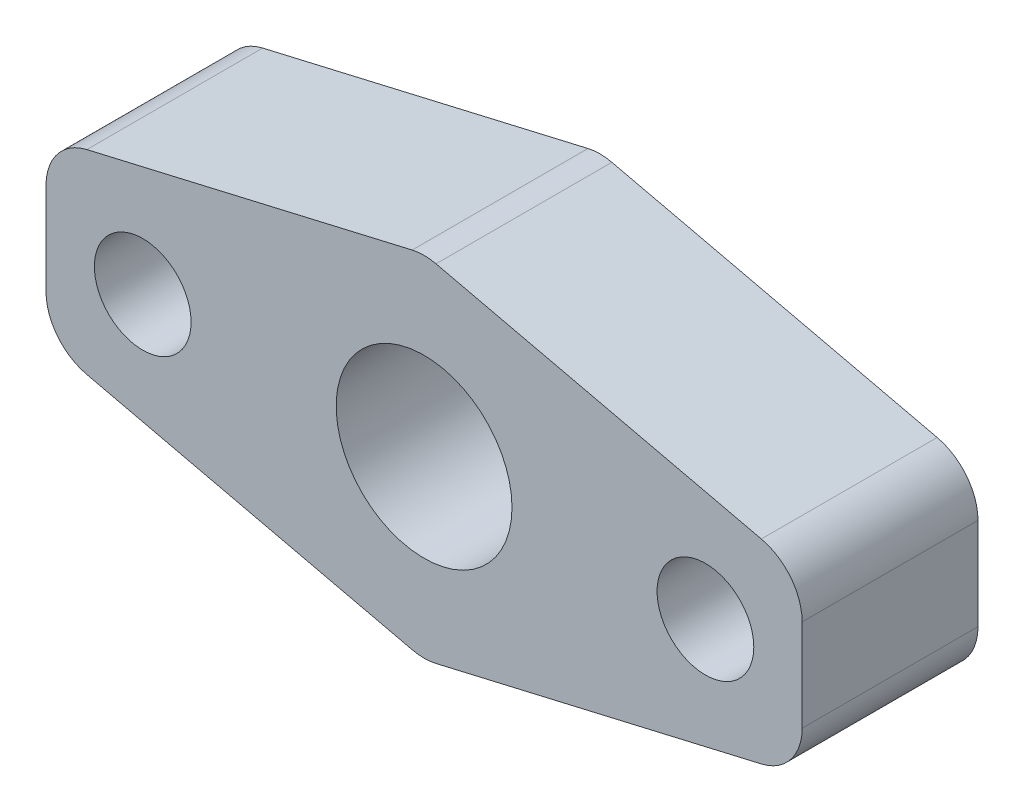
ISO-10303-21;
HEADER;
FILE_DESCRIPTION(('STEP AP214'),'2;1');
FILE_NAME('part.step','',(''),(''),'','','');
FILE_SCHEMA(('AUTOMOTIVE_DESIGN { 1 0 10303 214 1 1 1 1 }'));
ENDSEC;
DATA;
#1=APPLICATION_CONTEXT('core data for automotive mechanical design processes');
#2=APPLICATION_PROTOCOL_DEFINITION('international standard','automotive_design',2000,#1);
#3=PRODUCT_CONTEXT('',#1,'mechanical');
#4=PRODUCT('Part','Part','',(#3));
#5=PRODUCT_RELATED_PRODUCT_CATEGORY('part','',(#4));
#6=PRODUCT_DEFINITION_FORMATION('','',#4);
#7=PRODUCT_DEFINITION_CONTEXT('part definition',#1,'design');
#8=PRODUCT_DEFINITION('design','',#6,#7);
#9=PRODUCT_DEFINITION_SHAPE('','',#8);
#10=(LENGTH_UNIT() NAMED_UNIT(*) SI_UNIT(.MILLI.,.METRE.));
#11=(NAMED_UNIT(*) PLANE_ANGLE_UNIT() SI_UNIT($,.RADIAN.));
#12=(NAMED_UNIT(*) SI_UNIT($,.STERADIAN.) SOLID_ANGLE_UNIT());
#13=UNCERTAINTY_MEASURE_WITH_UNIT(LENGTH_MEASURE(1.E-05),#10,'distance_accuracy_value','');
#14=(GEOMETRIC_REPRESENTATION_CONTEXT(3) GLOBAL_UNCERTAINTY_ASSIGNED_CONTEXT((#13)) GLOBAL_UNIT_ASSIGNED_CONTEXT((#10,
#11,#12)) REPRESENTATION_CONTEXT('',''));
#15=CARTESIAN_POINT('',(0.,0.,0.));
#16=DIRECTION('',(0.,0.,1.));
#17=DIRECTION('',(1.,0.,0.));
#18=AXIS2_PLACEMENT_3D('',#15,#16,#17);
#19=CARTESIAN_POINT('',(0.,0.,10.));
#20=DIRECTION('',(0.,0.,1.));
#21=DIRECTION('',(1.,0.,0.));
#22=AXIS2_PLACEMENT_3D('',#19,#20,#21);
#23=PLANE('',#22);
#24=CARTESIAN_POINT('',(-16.,0.,10.));
#25=DIRECTION('',(0.,0.,1.));
#26=DIRECTION('',(1.,0.,0.));
#27=AXIS2_PLACEMENT_3D('',#24,#25,#26);
#28=CIRCLE('',#27,2.75);
#29=CARTESIAN_POINT('',(-13.25,0.,10.));
#30=VERTEX_POINT('',#29);
#31=EDGE_CURVE('E238',#30,#30,#28,.T.);
#32=ORIENTED_EDGE('',*,*,#31,.F.);
#33=EDGE_LOOP('',(#32));
#34=FACE_BOUND('',#33,.T.);
#35=DIRECTION('',(0.974008027039196,-0.226513494660278,0.));
#36=VECTOR('',#35,1.);
#37=CARTESIAN_POINT('',(0.,-10.,10.));
#38=LINE('',#37,#36);
#39=CARTESIAN_POINT('',(-19.1795404839808,-5.53964174791143,10.));
#40=VERTEX_POINT('',#39);
#41=CARTESIAN_POINT('',(-0.679540483980835,-9.84196732930678,10.));
#42=VERTEX_POINT('',#41);
#43=EDGE_CURVE('E229',#40,#42,#38,.T.);
#44=ORIENTED_EDGE('',*,*,#43,.T.);
#45=CARTESIAN_POINT('',(0.,-6.9199432481892,10.));
#46=DIRECTION('',(0.,0.,1.));
#47=DIRECTION('',(1.,0.,0.));
#48=AXIS2_PLACEMENT_3D('',#45,#46,#47);
#49=CIRCLE('',#48,3.);
#50=CARTESIAN_POINT('',(0.679540483980834,-9.84196732930678,10.));
#51=VERTEX_POINT('',#50);
#52=EDGE_CURVE('E181',#42,#51,#49,.T.);
#53=ORIENTED_EDGE('',*,*,#52,.T.);
#54=DIRECTION('',(0.974008027039197,0.226513494660278,0.));
#55=VECTOR('',#54,1.);
#56=CARTESIAN_POINT('',(21.5,-5.,10.));
#57=LINE('',#56,#55);
#58=CARTESIAN_POINT('',(19.1795404839808,-5.53964174791144,10.));
#59=VERTEX_POINT('',#58);
#60=EDGE_CURVE('E143',#51,#59,#57,.T.);
#61=ORIENTED_EDGE('',*,*,#60,.T.);
#62=CARTESIAN_POINT('',(18.5,-2.61761766679385,10.));
#63=DIRECTION('',(0.,0.,1.));
#64=DIRECTION('',(1.,0.,0.));
#65=AXIS2_PLACEMENT_3D('',#62,#63,#64);
#66=CIRCLE('',#65,3.);
#67=CARTESIAN_POINT('',(21.5,-2.61761766679385,10.));
#68=VERTEX_POINT('',#67);
#69=EDGE_CURVE('E55',#59,#68,#66,.T.);
#70=ORIENTED_EDGE('',*,*,#69,.T.);
#71=DIRECTION('',(0.,1.,0.));
#72=VECTOR('',#71,1.);
#73=CARTESIAN_POINT('',(21.5,-5.,10.));
#74=LINE('',#73,#72);
#75=CARTESIAN_POINT('',(21.5,2.61761766679384,10.));
#76=VERTEX_POINT('',#75);
#77=EDGE_CURVE('E160',#68,#76,#74,.T.);
#78=ORIENTED_EDGE('',*,*,#77,.T.);
#79=CARTESIAN_POINT('',(18.5,2.61761766679384,10.));
#80=DIRECTION('',(0.,0.,1.));
#81=DIRECTION('',(1.,0.,0.));
#82=AXIS2_PLACEMENT_3D('',#79,#80,#81);
#83=CIRCLE('',#82,3.);
#84=CARTESIAN_POINT('',(19.1795404839808,5.53964174791143,10.));
#85=VERTEX_POINT('',#84);
#86=EDGE_CURVE('E174',#76,#85,#83,.T.);
#87=ORIENTED_EDGE('',*,*,#86,.T.);
#88=DIRECTION('',(-0.974008027039197,0.226513494660278,0.));
#89=VECTOR('',#88,1.);
#90=CARTESIAN_POINT('',(0.,10.,10.));
#91=LINE('',#90,#89);
#92=CARTESIAN_POINT('',(0.679540483980838,9.84196732930678,10.));
#93=VERTEX_POINT('',#92);
#94=EDGE_CURVE('E154',#85,#93,#91,.T.);
#95=ORIENTED_EDGE('',*,*,#94,.T.);
#96=CARTESIAN_POINT('',(0.,6.91994324818919,10.));
#97=DIRECTION('',(0.,0.,1.));
#98=DIRECTION('',(1.,0.,0.));
#99=AXIS2_PLACEMENT_3D('',#96,#97,#98);
#100=CIRCLE('',#99,3.);
#101=CARTESIAN_POINT('',(-0.679540483980831,9.84196732930678,10.));
#102=VERTEX_POINT('',#101);
#103=EDGE_CURVE('E172',#93,#102,#100,.T.);
#104=ORIENTED_EDGE('',*,*,#103,.T.);
#105=DIRECTION('',(-0.974008027039197,-0.226513494660278,0.));
#106=VECTOR('',#105,1.);
#107=CARTESIAN_POINT('',(0.,10.,10.));
#108=LINE('',#107,#106);
#109=CARTESIAN_POINT('',(-19.1795404839808,5.53964174791144,10.));
#110=VERTEX_POINT('',#109);
#111=EDGE_CURVE('E212',#102,#110,#108,.T.);
#112=ORIENTED_EDGE('',*,*,#111,.T.);
#113=CARTESIAN_POINT('',(-18.5,2.61761766679385,10.));
#114=DIRECTION('',(0.,0.,1.));
#115=DIRECTION('',(1.,0.,0.));
#116=AXIS2_PLACEMENT_3D('',#113,#114,#115);
#117=CIRCLE('',#116,3.);
#118=CARTESIAN_POINT('',(-21.5,2.61761766679385,10.));
#119=VERTEX_POINT('',#118);
#120=EDGE_CURVE('E177',#110,#119,#117,.T.);
#121=ORIENTED_EDGE('',*,*,#120,.T.);
#122=DIRECTION('',(0.,-1.,0.));
#123=VECTOR('',#122,1.);
#124=CARTESIAN_POINT('',(-21.5,-5.,10.));
#125=LINE('',#124,#123);
#126=CARTESIAN_POINT('',(-21.5,-2.61761766679384,10.));
#127=VERTEX_POINT('',#126);
#128=EDGE_CURVE('E231',#119,#127,#125,.T.);
#129=ORIENTED_EDGE('',*,*,#128,.T.);
#130=CARTESIAN_POINT('',(-18.5,-2.61761766679384,10.));
#131=DIRECTION('',(0.,0.,1.));
#132=DIRECTION('',(1.,0.,0.));
#133=AXIS2_PLACEMENT_3D('',#130,#131,#132);
#134=CIRCLE('',#133,3.);
#135=EDGE_CURVE('E179',#127,#40,#134,.T.);
#136=ORIENTED_EDGE('',*,*,#135,.T.);
#137=EDGE_LOOP('',(#44,#53,#61,#70,#78,#87,#95,#104,#112,#121,#129,#136));
#138=FACE_BOUND('',#137,.T.);
#139=CARTESIAN_POINT('',(0.,0.,10.));
#140=DIRECTION('',(0.,0.,1.));
#141=DIRECTION('',(1.,0.,0.));
#142=AXIS2_PLACEMENT_3D('',#139,#140,#141);
#143=CIRCLE('',#142,5.);
#144=CARTESIAN_POINT('',(5.00000000000001,0.,10.));
#145=VERTEX_POINT('',#144);
#146=EDGE_CURVE('E224',#145,#145,#143,.T.);
#147=ORIENTED_EDGE('',*,*,#146,.F.);
#148=EDGE_LOOP('',(#147));
#149=FACE_BOUND('',#148,.T.);
#150=CARTESIAN_POINT('',(16.,0.,10.));
#151=DIRECTION('',(0.,0.,1.));
#152=DIRECTION('',(1.,0.,0.));
#153=AXIS2_PLACEMENT_3D('',#150,#151,#152);
#154=CIRCLE('',#153,2.75);
#155=CARTESIAN_POINT('',(18.75,0.,10.));
#156=VERTEX_POINT('',#155);
#157=EDGE_CURVE('E244',#156,#156,#154,.T.);
#158=ORIENTED_EDGE('',*,*,#157,.F.);
#159=EDGE_LOOP('',(#158));
#160=FACE_BOUND('',#159,.T.);
#161=ADVANCED_FACE('F33',(#34,#138,#149,#160),#23,.T.);
#162=CARTESIAN_POINT('',(0.,0.,0.));
#163=DIRECTION('',(0.,0.,1.));
#164=DIRECTION('',(1.,0.,0.));
#165=AXIS2_PLACEMENT_3D('',#162,#163,#164);
#166=PLANE('',#165);
#167=DIRECTION('',(0.974008027039197,0.226513494660278,0.));
#168=VECTOR('',#167,1.);
#169=CARTESIAN_POINT('',(21.5,-5.,0.));
#170=LINE('',#169,#168);
#171=CARTESIAN_POINT('',(0.679540483980834,-9.84196732930678,0.));
#172=VERTEX_POINT('',#171);
#173=CARTESIAN_POINT('',(19.1795404839808,-5.53964174791144,0.));
#174=VERTEX_POINT('',#173);
#175=EDGE_CURVE('E141',#172,#174,#170,.T.);
#176=ORIENTED_EDGE('',*,*,#175,.F.);
#177=CARTESIAN_POINT('',(0.,-6.9199432481892,0.));
#178=DIRECTION('',(0.,0.,1.));
#179=DIRECTION('',(1.,0.,0.));
#180=AXIS2_PLACEMENT_3D('',#177,#178,#179);
#181=CIRCLE('',#180,3.);
#182=CARTESIAN_POINT('',(-0.679540483980835,-9.84196732930678,0.));
#183=VERTEX_POINT('',#182);
#184=EDGE_CURVE('E124',#172,#183,#181,.F.);
#185=ORIENTED_EDGE('',*,*,#184,.T.);
#186=DIRECTION('',(0.974008027039196,-0.226513494660278,0.));
#187=VECTOR('',#186,1.);
#188=CARTESIAN_POINT('',(0.,-10.,0.));
#189=LINE('',#188,#187);
#190=CARTESIAN_POINT('',(-19.1795404839808,-5.53964174791143,0.));
#191=VERTEX_POINT('',#190);
#192=EDGE_CURVE('E152',#191,#183,#189,.T.);
#193=ORIENTED_EDGE('',*,*,#192,.F.);
#194=CARTESIAN_POINT('',(-18.5,-2.61761766679384,0.));
#195=DIRECTION('',(0.,0.,1.));
#196=DIRECTION('',(1.,0.,0.));
#197=AXIS2_PLACEMENT_3D('',#194,#195,#196);
#198=CIRCLE('',#197,3.);
#199=CARTESIAN_POINT('',(-21.5,-2.61761766679384,0.));
#200=VERTEX_POINT('',#199);
#201=EDGE_CURVE('E135',#191,#200,#198,.F.);
#202=ORIENTED_EDGE('',*,*,#201,.T.);
#203=DIRECTION('',(0.,-1.,0.));
#204=VECTOR('',#203,1.);
#205=CARTESIAN_POINT('',(-21.5,-5.,0.));
#206=LINE('',#205,#204);
#207=CARTESIAN_POINT('',(-21.5,2.61761766679385,0.));
#208=VERTEX_POINT('',#207);
#209=EDGE_CURVE('E156',#208,#200,#206,.T.);
#210=ORIENTED_EDGE('',*,*,#209,.F.);
#211=CARTESIAN_POINT('',(-18.5,2.61761766679385,0.));
#212=DIRECTION('',(0.,0.,1.));
#213=DIRECTION('',(1.,0.,0.));
#214=AXIS2_PLACEMENT_3D('',#211,#212,#213);
#215=CIRCLE('',#214,3.);
#216=CARTESIAN_POINT('',(-19.1795404839808,5.53964174791144,0.));
#217=VERTEX_POINT('',#216);
#218=EDGE_CURVE('E166',#208,#217,#215,.F.);
#219=ORIENTED_EDGE('',*,*,#218,.T.);
#220=DIRECTION('',(-0.974008027039197,-0.226513494660278,0.));
#221=VECTOR('',#220,1.);
#222=CARTESIAN_POINT('',(0.,10.,0.));
#223=LINE('',#222,#221);
#224=CARTESIAN_POINT('',(-0.679540483980831,9.84196732930678,0.));
#225=VERTEX_POINT('',#224);
#226=EDGE_CURVE('E219',#225,#217,#223,.T.);
#227=ORIENTED_EDGE('',*,*,#226,.F.);
#228=CARTESIAN_POINT('',(0.,6.91994324818919,0.));
#229=DIRECTION('',(0.,0.,1.));
#230=DIRECTION('',(1.,0.,0.));
#231=AXIS2_PLACEMENT_3D('',#228,#229,#230);
#232=CIRCLE('',#231,3.);
#233=CARTESIAN_POINT('',(0.679540483980838,9.84196732930678,0.));
#234=VERTEX_POINT('',#233);
#235=EDGE_CURVE('E144',#225,#234,#232,.F.);
#236=ORIENTED_EDGE('',*,*,#235,.T.);
#237=DIRECTION('',(-0.974008027039197,0.226513494660278,0.));
#238=VECTOR('',#237,1.);
#239=CARTESIAN_POINT('',(0.,10.,0.));
#240=LINE('',#239,#238);
#241=CARTESIAN_POINT('',(19.1795404839808,5.53964174791143,0.));
#242=VERTEX_POINT('',#241);
#243=EDGE_CURVE('E204',#242,#234,#240,.T.);
#244=ORIENTED_EDGE('',*,*,#243,.F.);
#245=CARTESIAN_POINT('',(18.5,2.61761766679384,0.));
#246=DIRECTION('',(0.,0.,1.));
#247=DIRECTION('',(1.,0.,0.));
#248=AXIS2_PLACEMENT_3D('',#245,#246,#247);
#249=CIRCLE('',#248,3.);
#250=CARTESIAN_POINT('',(21.5,2.61761766679384,0.));
#251=VERTEX_POINT('',#250);
#252=EDGE_CURVE('E163',#242,#251,#249,.F.);
#253=ORIENTED_EDGE('',*,*,#252,.T.);
#254=DIRECTION('',(0.,1.,0.));
#255=VECTOR('',#254,1.);
#256=CARTESIAN_POINT('',(21.5,-5.,0.));
#257=LINE('',#256,#255);
#258=CARTESIAN_POINT('',(21.5,-2.61761766679385,0.));
#259=VERTEX_POINT('',#258);
#260=EDGE_CURVE('E151',#259,#251,#257,.T.);
#261=ORIENTED_EDGE('',*,*,#260,.F.);
#262=CARTESIAN_POINT('',(18.5,-2.61761766679385,0.));
#263=DIRECTION('',(0.,0.,1.));
#264=DIRECTION('',(1.,0.,0.));
#265=AXIS2_PLACEMENT_3D('',#262,#263,#264);
#266=CIRCLE('',#265,3.);
#267=EDGE_CURVE('E150',#259,#174,#266,.F.);
#268=ORIENTED_EDGE('',*,*,#267,.T.);
#269=EDGE_LOOP('',(#176,#185,#193,#202,#210,#219,#227,#236,#244,#253,#261,#268));
#270=FACE_BOUND('',#269,.T.);
#271=CARTESIAN_POINT('',(0.,0.,0.));
#272=DIRECTION('',(0.,0.,1.));
#273=DIRECTION('',(1.,0.,0.));
#274=AXIS2_PLACEMENT_3D('',#271,#272,#273);
#275=CIRCLE('',#274,5.);
#276=CARTESIAN_POINT('',(5.00000000000001,0.,0.));
#277=VERTEX_POINT('',#276);
#278=EDGE_CURVE('E235',#277,#277,#275,.T.);
#279=ORIENTED_EDGE('',*,*,#278,.T.);
#280=EDGE_LOOP('',(#279));
#281=FACE_BOUND('',#280,.T.);
#282=CARTESIAN_POINT('',(-16.,0.,0.));
#283=DIRECTION('',(0.,0.,1.));
#284=DIRECTION('',(1.,0.,0.));
#285=AXIS2_PLACEMENT_3D('',#282,#283,#284);
#286=CIRCLE('',#285,2.75);
#287=CARTESIAN_POINT('',(-13.25,0.,0.));
#288=VERTEX_POINT('',#287);
#289=EDGE_CURVE('E241',#288,#288,#286,.T.);
#290=ORIENTED_EDGE('',*,*,#289,.T.);
#291=EDGE_LOOP('',(#290));
#292=FACE_BOUND('',#291,.T.);
#293=CARTESIAN_POINT('',(16.,0.,0.));
#294=DIRECTION('',(0.,0.,1.));
#295=DIRECTION('',(1.,0.,0.));
#296=AXIS2_PLACEMENT_3D('',#293,#294,#295);
#297=CIRCLE('',#296,2.75);
#298=CARTESIAN_POINT('',(18.75,0.,0.));
#299=VERTEX_POINT('',#298);
#300=EDGE_CURVE('E247',#299,#299,#297,.T.);
#301=ORIENTED_EDGE('',*,*,#300,.T.);
#302=EDGE_LOOP('',(#301));
#303=FACE_BOUND('',#302,.T.);
#304=ADVANCED_FACE('F147',(#270,#281,#292,#303),#166,.F.);
#305=CARTESIAN_POINT('',(0.,10.,10.));
#306=DIRECTION('',(-0.226513494660278,-0.974008027039196,0.));
#307=DIRECTION('',(0.974008027039196,-0.226513494660278,0.));
#308=AXIS2_PLACEMENT_3D('',#305,#306,#307);
#309=PLANE('',#308);
#310=ORIENTED_EDGE('',*,*,#94,.F.);
#311=DIRECTION('',(0.,0.,-1.));
#312=VECTOR('',#311,1.);
#313=CARTESIAN_POINT('',(19.1795404839808,5.53964174791143,10.));
#314=LINE('',#313,#312);
#315=EDGE_CURVE('E11',#85,#242,#314,.T.);
#316=ORIENTED_EDGE('',*,*,#315,.T.);
#317=ORIENTED_EDGE('',*,*,#243,.T.);
#318=DIRECTION('',(0.,0.,-1.));
#319=VECTOR('',#318,1.);
#320=CARTESIAN_POINT('',(0.679540483980838,9.84196732930678,10.));
#321=LINE('',#320,#319);
#322=EDGE_CURVE('E41',#234,#93,#321,.F.);
#323=ORIENTED_EDGE('',*,*,#322,.T.);
#324=EDGE_LOOP('',(#310,#316,#317,#323));
#325=FACE_BOUND('',#324,.T.);
#326=ADVANCED_FACE('F201',(#325),#309,.F.);
#327=CARTESIAN_POINT('',(0.,10.,10.));
#328=DIRECTION('',(0.226513494660278,-0.974008027039197,0.));
#329=DIRECTION('',(0.974008027039197,0.226513494660278,0.));
#330=AXIS2_PLACEMENT_3D('',#327,#328,#329);
#331=PLANE('',#330);
#332=ORIENTED_EDGE('',*,*,#226,.T.);
#333=DIRECTION('',(0.,0.,-1.));
#334=VECTOR('',#333,1.);
#335=CARTESIAN_POINT('',(-19.1795404839808,5.53964174791144,10.));
#336=LINE('',#335,#334);
#337=EDGE_CURVE('E191',#217,#110,#336,.F.);
#338=ORIENTED_EDGE('',*,*,#337,.T.);
#339=ORIENTED_EDGE('',*,*,#111,.F.);
#340=DIRECTION('',(0.,0.,-1.));
#341=VECTOR('',#340,1.);
#342=CARTESIAN_POINT('',(-0.679540483980831,9.84196732930678,10.));
#343=LINE('',#342,#341);
#344=EDGE_CURVE('E188',#102,#225,#343,.T.);
#345=ORIENTED_EDGE('',*,*,#344,.T.);
#346=EDGE_LOOP('',(#332,#338,#339,#345));
#347=FACE_BOUND('',#346,.T.);
#348=ADVANCED_FACE('F218',(#347),#331,.F.);
#349=CARTESIAN_POINT('',(-21.5,-5.,10.));
#350=DIRECTION('',(1.,0.,0.));
#351=DIRECTION('',(0.,0.,-1.));
#352=AXIS2_PLACEMENT_3D('',#349,#350,#351);
#353=PLANE('',#352);
#354=ORIENTED_EDGE('',*,*,#209,.T.);
#355=DIRECTION('',(0.,0.,-1.));
#356=VECTOR('',#355,1.);
#357=CARTESIAN_POINT('',(-21.5,-2.61761766679384,10.));
#358=LINE('',#357,#356);
#359=EDGE_CURVE('E186',#200,#127,#358,.F.);
#360=ORIENTED_EDGE('',*,*,#359,.T.);
#361=ORIENTED_EDGE('',*,*,#128,.F.);
#362=DIRECTION('',(0.,0.,-1.));
#363=VECTOR('',#362,1.);
#364=CARTESIAN_POINT('',(-21.5,2.61761766679385,10.));
#365=LINE('',#364,#363);
#366=EDGE_CURVE('E183',#119,#208,#365,.T.);
#367=ORIENTED_EDGE('',*,*,#366,.T.);
#368=EDGE_LOOP('',(#354,#360,#361,#367));
#369=FACE_BOUND('',#368,.T.);
#370=ADVANCED_FACE('F276',(#369),#353,.F.);
#371=CARTESIAN_POINT('',(0.,-10.,10.));
#372=DIRECTION('',(0.226513494660278,0.974008027039196,0.));
#373=DIRECTION('',(-0.974008027039196,0.226513494660278,0.));
#374=AXIS2_PLACEMENT_3D('',#371,#372,#373);
#375=PLANE('',#374);
#376=ORIENTED_EDGE('',*,*,#192,.T.);
#377=DIRECTION('',(0.,0.,-1.));
#378=VECTOR('',#377,1.);
#379=CARTESIAN_POINT('',(-0.679540483980836,-9.84196732930678,10.));
#380=LINE('',#379,#378);
#381=EDGE_CURVE('E129',#183,#42,#380,.F.);
#382=ORIENTED_EDGE('',*,*,#381,.T.);
#383=ORIENTED_EDGE('',*,*,#43,.F.);
#384=DIRECTION('',(0.,0.,-1.));
#385=VECTOR('',#384,1.);
#386=CARTESIAN_POINT('',(-19.1795404839808,-5.53964174791143,10.));
#387=LINE('',#386,#385);
#388=EDGE_CURVE('E134',#40,#191,#387,.T.);
#389=ORIENTED_EDGE('',*,*,#388,.T.);
#390=EDGE_LOOP('',(#376,#382,#383,#389));
#391=FACE_BOUND('',#390,.T.);
#392=ADVANCED_FACE('F273',(#391),#375,.F.);
#393=CARTESIAN_POINT('',(21.5,-5.,10.));
#394=DIRECTION('',(-0.226513494660278,0.974008027039197,0.));
#395=DIRECTION('',(-0.974008027039197,-0.226513494660278,0.));
#396=AXIS2_PLACEMENT_3D('',#393,#394,#395);
#397=PLANE('',#396);
#398=ORIENTED_EDGE('',*,*,#60,.F.);
#399=DIRECTION('',(0.,0.,-1.));
#400=VECTOR('',#399,1.);
#401=CARTESIAN_POINT('',(0.679540483980837,-9.84196732930678,10.));
#402=LINE('',#401,#400);
#403=EDGE_CURVE('E128',#51,#172,#402,.T.);
#404=ORIENTED_EDGE('',*,*,#403,.T.);
#405=ORIENTED_EDGE('',*,*,#175,.T.);
#406=DIRECTION('',(0.,0.,-1.));
#407=VECTOR('',#406,1.);
#408=CARTESIAN_POINT('',(19.1795404839808,-5.53964174791144,10.));
#409=LINE('',#408,#407);
#410=EDGE_CURVE('E145',#174,#59,#409,.F.);
#411=ORIENTED_EDGE('',*,*,#410,.T.);
#412=EDGE_LOOP('',(#398,#404,#405,#411));
#413=FACE_BOUND('',#412,.T.);
#414=ADVANCED_FACE('F140',(#413),#397,.F.);
#415=CARTESIAN_POINT('',(21.5,-5.,10.));
#416=DIRECTION('',(-1.,0.,0.));
#417=DIRECTION('',(0.,0.,1.));
#418=AXIS2_PLACEMENT_3D('',#415,#416,#417);
#419=PLANE('',#418);
#420=ORIENTED_EDGE('',*,*,#77,.F.);
#421=DIRECTION('',(0.,0.,-1.));
#422=VECTOR('',#421,1.);
#423=CARTESIAN_POINT('',(21.5,-2.61761766679385,10.));
#424=LINE('',#423,#422);
#425=EDGE_CURVE('E194',#68,#259,#424,.T.);
#426=ORIENTED_EDGE('',*,*,#425,.T.);
#427=ORIENTED_EDGE('',*,*,#260,.T.);
#428=DIRECTION('',(0.,0.,-1.));
#429=VECTOR('',#428,1.);
#430=CARTESIAN_POINT('',(21.5,2.61761766679384,10.));
#431=LINE('',#430,#429);
#432=EDGE_CURVE('E48',#251,#76,#431,.F.);
#433=ORIENTED_EDGE('',*,*,#432,.T.);
#434=EDGE_LOOP('',(#420,#426,#427,#433));
#435=FACE_BOUND('',#434,.T.);
#436=ADVANCED_FACE('F268',(#435),#419,.F.);
#437=CARTESIAN_POINT('',(0.,0.,10.));
#438=DIRECTION('',(0.,0.,-1.));
#439=DIRECTION('',(-1.,0.,0.));
#440=AXIS2_PLACEMENT_3D('',#437,#438,#439);
#441=CYLINDRICAL_SURFACE('',#440,5.);
#442=ORIENTED_EDGE('',*,*,#146,.T.);
#443=EDGE_LOOP('',(#442));
#444=FACE_BOUND('',#443,.T.);
#445=ORIENTED_EDGE('',*,*,#278,.F.);
#446=EDGE_LOOP('',(#445));
#447=FACE_BOUND('',#446,.T.);
#448=ADVANCED_FACE('F265',(#444,#447),#441,.F.);
#449=CARTESIAN_POINT('',(-16.,0.,10.));
#450=DIRECTION('',(0.,0.,-1.));
#451=DIRECTION('',(-1.,0.,0.));
#452=AXIS2_PLACEMENT_3D('',#449,#450,#451);
#453=CYLINDRICAL_SURFACE('',#452,2.75);
#454=ORIENTED_EDGE('',*,*,#31,.T.);
#455=EDGE_LOOP('',(#454));
#456=FACE_BOUND('',#455,.T.);
#457=ORIENTED_EDGE('',*,*,#289,.F.);
#458=EDGE_LOOP('',(#457));
#459=FACE_BOUND('',#458,.T.);
#460=ADVANCED_FACE('F399',(#456,#459),#453,.F.);
#461=CARTESIAN_POINT('',(16.,0.,10.));
#462=DIRECTION('',(0.,0.,-1.));
#463=DIRECTION('',(-1.,0.,0.));
#464=AXIS2_PLACEMENT_3D('',#461,#462,#463);
#465=CYLINDRICAL_SURFACE('',#464,2.75);
#466=ORIENTED_EDGE('',*,*,#157,.T.);
#467=EDGE_LOOP('',(#466));
#468=FACE_BOUND('',#467,.T.);
#469=ORIENTED_EDGE('',*,*,#300,.F.);
#470=EDGE_LOOP('',(#469));
#471=FACE_BOUND('',#470,.T.);
#472=ADVANCED_FACE('F253',(#468,#471),#465,.F.);
#473=CARTESIAN_POINT('',(0.,-6.9199432481892,10.));
#474=DIRECTION('',(0.,0.,-1.));
#475=DIRECTION('',(-1.,0.,0.));
#476=AXIS2_PLACEMENT_3D('',#473,#474,#475);
#477=CYLINDRICAL_SURFACE('',#476,3.);
#478=ORIENTED_EDGE('',*,*,#52,.F.);
#479=ORIENTED_EDGE('',*,*,#381,.F.);
#480=ORIENTED_EDGE('',*,*,#184,.F.);
#481=ORIENTED_EDGE('',*,*,#403,.F.);
#482=EDGE_LOOP('',(#478,#479,#480,#481));
#483=FACE_BOUND('',#482,.T.);
#484=ADVANCED_FACE('F127',(#483),#477,.T.);
#485=CARTESIAN_POINT('',(-18.5,-2.61761766679384,10.));
#486=DIRECTION('',(0.,0.,-1.));
#487=DIRECTION('',(-1.,0.,0.));
#488=AXIS2_PLACEMENT_3D('',#485,#486,#487);
#489=CYLINDRICAL_SURFACE('',#488,3.);
#490=ORIENTED_EDGE('',*,*,#135,.F.);
#491=ORIENTED_EDGE('',*,*,#359,.F.);
#492=ORIENTED_EDGE('',*,*,#201,.F.);
#493=ORIENTED_EDGE('',*,*,#388,.F.);
#494=EDGE_LOOP('',(#490,#491,#492,#493));
#495=FACE_BOUND('',#494,.T.);
#496=ADVANCED_FACE('F287',(#495),#489,.T.);
#497=CARTESIAN_POINT('',(-18.5,2.61761766679385,10.));
#498=DIRECTION('',(0.,0.,-1.));
#499=DIRECTION('',(-1.,0.,0.));
#500=AXIS2_PLACEMENT_3D('',#497,#498,#499);
#501=CYLINDRICAL_SURFACE('',#500,3.);
#502=ORIENTED_EDGE('',*,*,#120,.F.);
#503=ORIENTED_EDGE('',*,*,#337,.F.);
#504=ORIENTED_EDGE('',*,*,#218,.F.);
#505=ORIENTED_EDGE('',*,*,#366,.F.);
#506=EDGE_LOOP('',(#502,#503,#504,#505));
#507=FACE_BOUND('',#506,.T.);
#508=ADVANCED_FACE('F290',(#507),#501,.T.);
#509=CARTESIAN_POINT('',(18.5,-2.61761766679385,10.));
#510=DIRECTION('',(0.,0.,-1.));
#511=DIRECTION('',(-1.,0.,0.));
#512=AXIS2_PLACEMENT_3D('',#509,#510,#511);
#513=CYLINDRICAL_SURFACE('',#512,3.);
#514=ORIENTED_EDGE('',*,*,#69,.F.);
#515=ORIENTED_EDGE('',*,*,#410,.F.);
#516=ORIENTED_EDGE('',*,*,#267,.F.);
#517=ORIENTED_EDGE('',*,*,#425,.F.);
#518=EDGE_LOOP('',(#514,#515,#516,#517));
#519=FACE_BOUND('',#518,.T.);
#520=ADVANCED_FACE('F294',(#519),#513,.T.);
#521=CARTESIAN_POINT('',(18.5,2.61761766679384,10.));
#522=DIRECTION('',(0.,0.,-1.));
#523=DIRECTION('',(-1.,0.,0.));
#524=AXIS2_PLACEMENT_3D('',#521,#522,#523);
#525=CYLINDRICAL_SURFACE('',#524,3.);
#526=ORIENTED_EDGE('',*,*,#86,.F.);
#527=ORIENTED_EDGE('',*,*,#432,.F.);
#528=ORIENTED_EDGE('',*,*,#252,.F.);
#529=ORIENTED_EDGE('',*,*,#315,.F.);
#530=EDGE_LOOP('',(#526,#527,#528,#529));
#531=FACE_BOUND('',#530,.T.);
#532=ADVANCED_FACE('F297',(#531),#525,.T.);
#533=CARTESIAN_POINT('',(0.,6.91994324818919,10.));
#534=DIRECTION('',(0.,0.,-1.));
#535=DIRECTION('',(-1.,0.,0.));
#536=AXIS2_PLACEMENT_3D('',#533,#534,#535);
#537=CYLINDRICAL_SURFACE('',#536,3.);
#538=ORIENTED_EDGE('',*,*,#103,.F.);
#539=ORIENTED_EDGE('',*,*,#322,.F.);
#540=ORIENTED_EDGE('',*,*,#235,.F.);
#541=ORIENTED_EDGE('',*,*,#344,.F.);
#542=EDGE_LOOP('',(#538,#539,#540,#541));
#543=FACE_BOUND('',#542,.T.);
#544=ADVANCED_FACE('F35',(#543),#537,.T.);
#545=CLOSED_SHELL('',(#161,#304,#326,#348,#370,#392,#414,#436,#448,#460,#472,#484,#496,#508,
#520,#532,#544));
#546=MANIFOLD_SOLID_BREP('B2',#545);
#547=ADVANCED_BREP_SHAPE_REPRESENTATION('',(#18,#546),#14);
#548=SHAPE_DEFINITION_REPRESENTATION(#9,#547);
ENDSEC;
END-ISO-10303-21;
